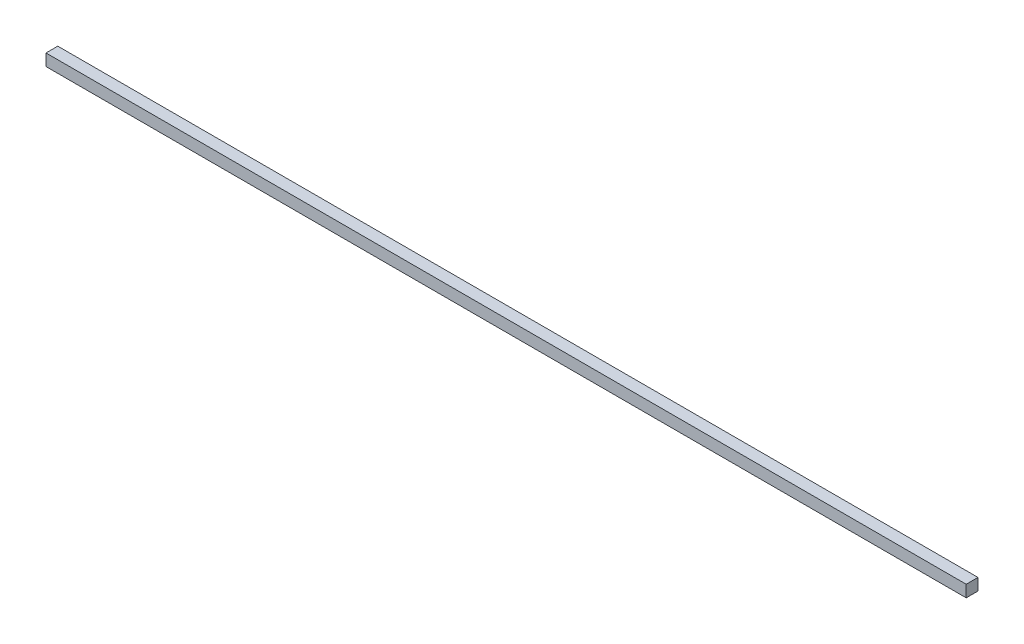
ISO-10303-21;
HEADER;
FILE_DESCRIPTION(('STEP AP214'),'2;1');
FILE_NAME('part.step','',(''),(''),'','','');
FILE_SCHEMA(('AUTOMOTIVE_DESIGN { 1 0 10303 214 1 1 1 1 }'));
ENDSEC;
DATA;
#1=APPLICATION_CONTEXT('core data for automotive mechanical design processes');
#2=APPLICATION_PROTOCOL_DEFINITION('international standard','automotive_design',2000,#1);
#3=PRODUCT_CONTEXT('',#1,'mechanical');
#4=PRODUCT('Part','Part','',(#3));
#5=PRODUCT_RELATED_PRODUCT_CATEGORY('part','',(#4));
#6=PRODUCT_DEFINITION_FORMATION('','',#4);
#7=PRODUCT_DEFINITION_CONTEXT('part definition',#1,'design');
#8=PRODUCT_DEFINITION('design','',#6,#7);
#9=PRODUCT_DEFINITION_SHAPE('','',#8);
#10=(LENGTH_UNIT() NAMED_UNIT(*) SI_UNIT(.MILLI.,.METRE.));
#11=(NAMED_UNIT(*) PLANE_ANGLE_UNIT() SI_UNIT($,.RADIAN.));
#12=(NAMED_UNIT(*) SI_UNIT($,.STERADIAN.) SOLID_ANGLE_UNIT());
#13=UNCERTAINTY_MEASURE_WITH_UNIT(LENGTH_MEASURE(1.E-05),#10,'distance_accuracy_value','');
#14=(GEOMETRIC_REPRESENTATION_CONTEXT(3) GLOBAL_UNCERTAINTY_ASSIGNED_CONTEXT((#13)) GLOBAL_UNIT_ASSIGNED_CONTEXT((#10,
#11,#12)) REPRESENTATION_CONTEXT('',''));
#15=CARTESIAN_POINT('',(0.,0.,0.));
#16=DIRECTION('',(0.,0.,1.));
#17=DIRECTION('',(1.,0.,0.));
#18=AXIS2_PLACEMENT_3D('',#15,#16,#17);
#19=CARTESIAN_POINT('',(-82.1515602948095,9.97857142857143,5.));
#20=DIRECTION('',(1.,0.,0.));
#21=DIRECTION('',(0.,0.,-1.));
#22=AXIS2_PLACEMENT_3D('',#19,#20,#21);
#23=PLANE('',#22);
#24=DIRECTION('',(0.,-1.,0.));
#25=VECTOR('',#24,1.);
#26=CARTESIAN_POINT('',(-82.1515602948095,9.97857142857143,0.));
#27=LINE('',#26,#25);
#28=CARTESIAN_POINT('',(-82.1515602948095,9.97857142857143,0.));
#29=VERTEX_POINT('',#28);
#30=CARTESIAN_POINT('',(-82.1515602948095,4.97857142857143,0.));
#31=VERTEX_POINT('',#30);
#32=EDGE_CURVE('E96',#29,#31,#27,.T.);
#33=ORIENTED_EDGE('',*,*,#32,.T.);
#34=DIRECTION('',(0.,0.,-1.));
#35=VECTOR('',#34,1.);
#36=CARTESIAN_POINT('',(-82.1515602948095,4.97857142857143,5.));
#37=LINE('',#36,#35);
#38=CARTESIAN_POINT('',(-82.1515602948095,4.97857142857143,5.));
#39=VERTEX_POINT('',#38);
#40=EDGE_CURVE('E11',#39,#31,#37,.T.);
#41=ORIENTED_EDGE('',*,*,#40,.F.);
#42=DIRECTION('',(0.,-1.,0.));
#43=VECTOR('',#42,1.);
#44=CARTESIAN_POINT('',(-82.1515602948095,9.97857142857143,5.));
#45=LINE('',#44,#43);
#46=CARTESIAN_POINT('',(-82.1515602948095,9.97857142857143,5.));
#47=VERTEX_POINT('',#46);
#48=EDGE_CURVE('E84',#47,#39,#45,.T.);
#49=ORIENTED_EDGE('',*,*,#48,.F.);
#50=DIRECTION('',(0.,0.,-1.));
#51=VECTOR('',#50,1.);
#52=CARTESIAN_POINT('',(-82.1515602948095,9.97857142857143,5.));
#53=LINE('',#52,#51);
#54=EDGE_CURVE('E92',#47,#29,#53,.T.);
#55=ORIENTED_EDGE('',*,*,#54,.T.);
#56=EDGE_LOOP('',(#33,#41,#49,#55));
#57=FACE_BOUND('',#56,.T.);
#58=ADVANCED_FACE('F33',(#57),#23,.F.);
#59=CARTESIAN_POINT('',(-82.1515602948095,4.97857142857143,5.));
#60=DIRECTION('',(0.,1.,0.));
#61=DIRECTION('',(-1.,0.,0.));
#62=AXIS2_PLACEMENT_3D('',#59,#60,#61);
#63=PLANE('',#62);
#64=DIRECTION('',(1.,0.,0.));
#65=VECTOR('',#64,1.);
#66=CARTESIAN_POINT('',(-82.1515602948095,4.97857142857143,0.));
#67=LINE('',#66,#65);
#68=CARTESIAN_POINT('',(307.848439705191,4.97857142857143,0.));
#69=VERTEX_POINT('',#68);
#70=EDGE_CURVE('E88',#31,#69,#67,.T.);
#71=ORIENTED_EDGE('',*,*,#70,.T.);
#72=DIRECTION('',(0.,0.,-1.));
#73=VECTOR('',#72,1.);
#74=CARTESIAN_POINT('',(307.848439705191,4.97857142857143,5.));
#75=LINE('',#74,#73);
#76=CARTESIAN_POINT('',(307.848439705191,4.97857142857143,5.));
#77=VERTEX_POINT('',#76);
#78=EDGE_CURVE('E41',#77,#69,#75,.T.);
#79=ORIENTED_EDGE('',*,*,#78,.F.);
#80=DIRECTION('',(1.,0.,0.));
#81=VECTOR('',#80,1.);
#82=CARTESIAN_POINT('',(-82.1515602948095,4.97857142857143,5.));
#83=LINE('',#82,#81);
#84=EDGE_CURVE('E79',#39,#77,#83,.T.);
#85=ORIENTED_EDGE('',*,*,#84,.F.);
#86=ORIENTED_EDGE('',*,*,#40,.T.);
#87=EDGE_LOOP('',(#71,#79,#85,#86));
#88=FACE_BOUND('',#87,.T.);
#89=ADVANCED_FACE('F87',(#88),#63,.F.);
#90=CARTESIAN_POINT('',(307.848439705191,9.97857142857143,5.));
#91=DIRECTION('',(-1.,0.,0.));
#92=DIRECTION('',(0.,0.,1.));
#93=AXIS2_PLACEMENT_3D('',#90,#91,#92);
#94=PLANE('',#93);
#95=DIRECTION('',(0.,1.,0.));
#96=VECTOR('',#95,1.);
#97=CARTESIAN_POINT('',(307.848439705191,9.97857142857143,0.));
#98=LINE('',#97,#96);
#99=CARTESIAN_POINT('',(307.848439705191,9.97857142857143,0.));
#100=VERTEX_POINT('',#99);
#101=EDGE_CURVE('E66',#69,#100,#98,.T.);
#102=ORIENTED_EDGE('',*,*,#101,.T.);
#103=DIRECTION('',(0.,0.,-1.));
#104=VECTOR('',#103,1.);
#105=CARTESIAN_POINT('',(307.848439705191,9.97857142857143,5.));
#106=LINE('',#105,#104);
#107=CARTESIAN_POINT('',(307.848439705191,9.97857142857143,5.));
#108=VERTEX_POINT('',#107);
#109=EDGE_CURVE('E89',#108,#100,#106,.T.);
#110=ORIENTED_EDGE('',*,*,#109,.F.);
#111=DIRECTION('',(0.,1.,0.));
#112=VECTOR('',#111,1.);
#113=CARTESIAN_POINT('',(307.848439705191,9.97857142857143,5.));
#114=LINE('',#113,#112);
#115=EDGE_CURVE('E82',#77,#108,#114,.T.);
#116=ORIENTED_EDGE('',*,*,#115,.F.);
#117=ORIENTED_EDGE('',*,*,#78,.T.);
#118=EDGE_LOOP('',(#102,#110,#116,#117));
#119=FACE_BOUND('',#118,.T.);
#120=ADVANCED_FACE('F90',(#119),#94,.F.);
#121=CARTESIAN_POINT('',(-82.1515602948095,9.97857142857143,5.));
#122=DIRECTION('',(0.,-1.,0.));
#123=DIRECTION('',(0.,0.,-1.));
#124=AXIS2_PLACEMENT_3D('',#121,#122,#123);
#125=PLANE('',#124);
#126=DIRECTION('',(-1.,0.,0.));
#127=VECTOR('',#126,1.);
#128=CARTESIAN_POINT('',(-82.1515602948095,9.97857142857143,0.));
#129=LINE('',#128,#127);
#130=EDGE_CURVE('E72',#100,#29,#129,.T.);
#131=ORIENTED_EDGE('',*,*,#130,.T.);
#132=ORIENTED_EDGE('',*,*,#54,.F.);
#133=DIRECTION('',(-1.,0.,0.));
#134=VECTOR('',#133,1.);
#135=CARTESIAN_POINT('',(-82.1515602948095,9.97857142857143,5.));
#136=LINE('',#135,#134);
#137=EDGE_CURVE('E49',#108,#47,#136,.T.);
#138=ORIENTED_EDGE('',*,*,#137,.F.);
#139=ORIENTED_EDGE('',*,*,#109,.T.);
#140=EDGE_LOOP('',(#131,#132,#138,#139));
#141=FACE_BOUND('',#140,.T.);
#142=ADVANCED_FACE('F103',(#141),#125,.F.);
#143=CARTESIAN_POINT('',(0.,0.,5.));
#144=DIRECTION('',(0.,0.,1.));
#145=DIRECTION('',(1.,0.,0.));
#146=AXIS2_PLACEMENT_3D('',#143,#144,#145);
#147=PLANE('',#146);
#148=ORIENTED_EDGE('',*,*,#48,.T.);
#149=ORIENTED_EDGE('',*,*,#84,.T.);
#150=ORIENTED_EDGE('',*,*,#115,.T.);
#151=ORIENTED_EDGE('',*,*,#137,.T.);
#152=EDGE_LOOP('',(#148,#149,#150,#151));
#153=FACE_BOUND('',#152,.T.);
#154=ADVANCED_FACE('F80',(#153),#147,.T.);
#155=CARTESIAN_POINT('',(0.,0.,0.));
#156=DIRECTION('',(0.,0.,1.));
#157=DIRECTION('',(1.,0.,0.));
#158=AXIS2_PLACEMENT_3D('',#155,#156,#157);
#159=PLANE('',#158);
#160=ORIENTED_EDGE('',*,*,#32,.F.);
#161=ORIENTED_EDGE('',*,*,#130,.F.);
#162=ORIENTED_EDGE('',*,*,#101,.F.);
#163=ORIENTED_EDGE('',*,*,#70,.F.);
#164=EDGE_LOOP('',(#160,#161,#162,#163));
#165=FACE_BOUND('',#164,.T.);
#166=ADVANCED_FACE('F106',(#165),#159,.F.);
#167=CLOSED_SHELL('',(#58,#89,#120,#142,#154,#166));
#168=MANIFOLD_SOLID_BREP('B2',#167);
#169=ADVANCED_BREP_SHAPE_REPRESENTATION('',(#18,#168),#14);
#170=SHAPE_DEFINITION_REPRESENTATION(#9,#169);
ENDSEC;
END-ISO-10303-21;
